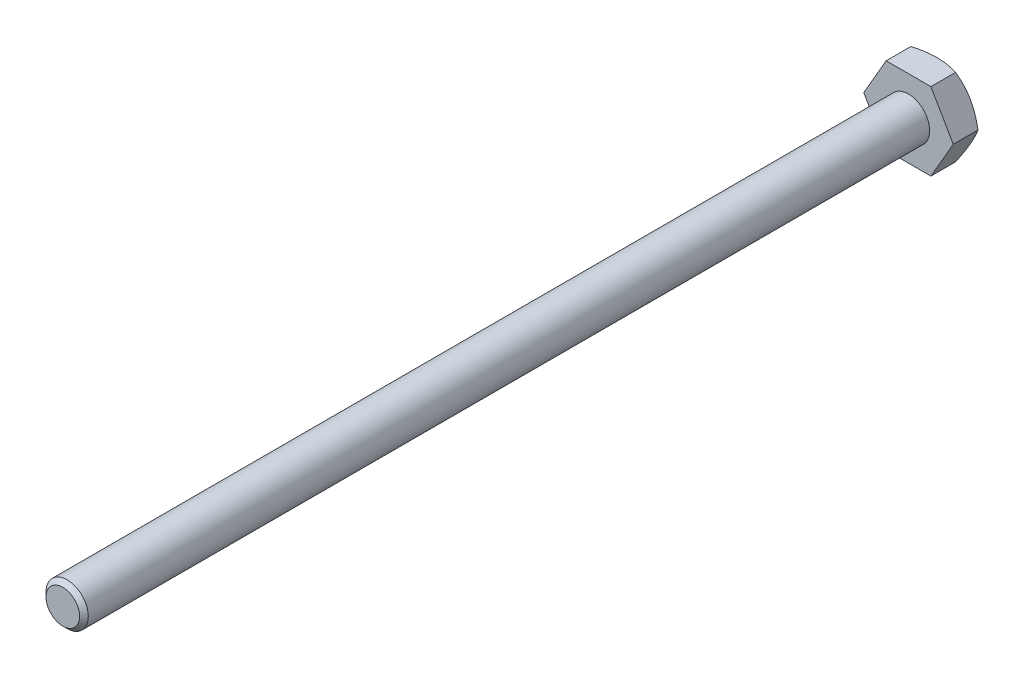
ISO-10303-21;
HEADER;
FILE_DESCRIPTION(('STEP AP214'),'2;1');
FILE_NAME('part.step','',(''),(''),'','','');
FILE_SCHEMA(('AUTOMOTIVE_DESIGN { 1 0 10303 214 1 1 1 1 }'));
ENDSEC;
DATA;
#1=APPLICATION_CONTEXT('core data for automotive mechanical design processes');
#2=APPLICATION_PROTOCOL_DEFINITION('international standard','automotive_design',2000,#1);
#3=PRODUCT_CONTEXT('',#1,'mechanical');
#4=PRODUCT('Part','Part','',(#3));
#5=PRODUCT_RELATED_PRODUCT_CATEGORY('part','',(#4));
#6=PRODUCT_DEFINITION_FORMATION('','',#4);
#7=PRODUCT_DEFINITION_CONTEXT('part definition',#1,'design');
#8=PRODUCT_DEFINITION('design','',#6,#7);
#9=PRODUCT_DEFINITION_SHAPE('','',#8);
#10=(LENGTH_UNIT() NAMED_UNIT(*) SI_UNIT(.MILLI.,.METRE.));
#11=(NAMED_UNIT(*) PLANE_ANGLE_UNIT() SI_UNIT($,.RADIAN.));
#12=(NAMED_UNIT(*) SI_UNIT($,.STERADIAN.) SOLID_ANGLE_UNIT());
#13=UNCERTAINTY_MEASURE_WITH_UNIT(LENGTH_MEASURE(1.E-05),#10,'distance_accuracy_value','');
#14=(GEOMETRIC_REPRESENTATION_CONTEXT(3) GLOBAL_UNCERTAINTY_ASSIGNED_CONTEXT((#13)) GLOBAL_UNIT_ASSIGNED_CONTEXT((#10,
#11,#12)) REPRESENTATION_CONTEXT('',''));
#15=CARTESIAN_POINT('',(0.,0.,0.));
#16=DIRECTION('',(0.,0.,1.));
#17=DIRECTION('',(1.,0.,0.));
#18=AXIS2_PLACEMENT_3D('',#15,#16,#17);
#19=CARTESIAN_POINT('',(1.58771324027147,-2.75,2.));
#20=DIRECTION('',(-0.866025403784439,0.5,0.));
#21=DIRECTION('',(-0.5,-0.866025403784439,0.));
#22=AXIS2_PLACEMENT_3D('',#19,#20,#21);
#23=PLANE('',#22);
#24=CARTESIAN_POINT('',(3.17554195059678,0.000200000000001707,0.245686763364756));
#25=CARTESIAN_POINT('',(3.10576962051743,-0.120649220659902,0.205387662249245));
#26=CARTESIAN_POINT('',(3.03539502097908,-0.242541602622629,0.168736902597647));
#27=CARTESIAN_POINT('',(2.89342717394439,-0.48843712672789,0.104762182969799));
#28=CARTESIAN_POINT('',(2.82183140359858,-0.612444638573854,0.077460855674506));
#29=CARTESIAN_POINT('',(2.67952717191842,-0.858922797975943,0.0349617452941293));
#30=CARTESIAN_POINT('',(2.60884060771577,-0.981355518587416,0.019481118622464));
#31=CARTESIAN_POINT('',(2.46713482015519,-1.22679714236891,0.000999397369945066));
#32=CARTESIAN_POINT('',(2.39611611197038,-1.34980515323291,-0.00201700053739113));
#33=CARTESIAN_POINT('',(2.26341005486544,-1.57965878661079,0.0042531454285534));
#34=CARTESIAN_POINT('',(2.20170285541369,-1.68653879125402,0.0120001542767035));
#35=CARTESIAN_POINT('',(2.07869048467395,-1.89960246733475,0.0365551810643576));
#36=CARTESIAN_POINT('',(2.01738573896433,-2.00578540164889,0.0533715896505804));
#37=CARTESIAN_POINT('',(1.89411967378235,-2.21928848939318,0.0954119223459683));
#38=CARTESIAN_POINT('',(1.83217395817123,-2.32658161614285,0.120814080687237));
#39=CARTESIAN_POINT('',(1.70920651275307,-2.53956747928405,0.17846722583998));
#40=CARTESIAN_POINT('',(1.64818320715446,-2.64526294502665,0.210704663298978));
#41=CARTESIAN_POINT('',(1.58759777021763,-2.7502,0.245686763364763));
#42=B_SPLINE_CURVE_WITH_KNOTS('',3,(#24,#25,#26,#27,#28,#29,#30,#31,#32,#33,#34,#35,#36,#37,#38,
#39,#40,#41),.UNSPECIFIED.,.F.,.F.,(4,2,2,2,2,2,2,2,4),(0.,0.435912828725887,0.872873557116331,
1.29901931904671,1.72464171213573,2.09526089052937,2.46622354066374,2.84541551798557,
3.22386274754524),.UNSPECIFIED.);
#43=CARTESIAN_POINT('',(3.17542648054294,0.,0.245620093061864));
#44=VERTEX_POINT('',#43);
#45=CARTESIAN_POINT('',(2.38156986040721,-1.375,0.));
#46=VERTEX_POINT('',#45);
#47=EDGE_CURVE('E130',#44,#46,#42,.T.);
#48=ORIENTED_EDGE('',*,*,#47,.F.);
#49=DIRECTION('',(0.,0.,-1.));
#50=VECTOR('',#49,1.);
#51=CARTESIAN_POINT('',(3.17542648054294,0.,2.));
#52=LINE('',#51,#50);
#53=CARTESIAN_POINT('',(3.17542648054294,0.,2.));
#54=VERTEX_POINT('',#53);
#55=EDGE_CURVE('E134',#54,#44,#52,.T.);
#56=ORIENTED_EDGE('',*,*,#55,.F.);
#57=DIRECTION('',(0.5,0.866025403784438,0.));
#58=VECTOR('',#57,1.);
#59=CARTESIAN_POINT('',(1.58771324027147,-2.75,2.));
#60=LINE('',#59,#58);
#61=CARTESIAN_POINT('',(1.58771324027147,-2.75,2.));
#62=VERTEX_POINT('',#61);
#63=EDGE_CURVE('E254',#62,#54,#60,.T.);
#64=ORIENTED_EDGE('',*,*,#63,.F.);
#65=DIRECTION('',(0.,0.,-1.));
#66=VECTOR('',#65,1.);
#67=CARTESIAN_POINT('',(1.58771324027147,-2.75,2.));
#68=LINE('',#67,#66);
#69=CARTESIAN_POINT('',(1.58771324027148,-2.75,0.245620093061862));
#70=VERTEX_POINT('',#69);
#71=EDGE_CURVE('E230',#62,#70,#68,.T.);
#72=ORIENTED_EDGE('',*,*,#71,.T.);
#73=EDGE_CURVE('E192',#46,#70,#42,.T.);
#74=ORIENTED_EDGE('',*,*,#73,.F.);
#75=EDGE_LOOP('',(#48,#56,#64,#72,#74));
#76=FACE_BOUND('',#75,.T.);
#77=ADVANCED_FACE('F38',(#76),#23,.F.);
#78=CARTESIAN_POINT('',(3.17542648054294,0.,2.));
#79=DIRECTION('',(-0.866025403784438,-0.5,0.));
#80=DIRECTION('',(0.5,-0.866025403784438,0.));
#81=AXIS2_PLACEMENT_3D('',#78,#79,#80);
#82=PLANE('',#81);
#83=CARTESIAN_POINT('',(1.58759777021763,2.7502,0.245686763364752));
#84=CARTESIAN_POINT('',(1.65737010029698,2.6293507793401,0.205387662249251));
#85=CARTESIAN_POINT('',(1.72774469983533,2.50745839737737,0.168736902597654));
#86=CARTESIAN_POINT('',(1.86971254687003,2.26156287327211,0.104762182969802));
#87=CARTESIAN_POINT('',(1.94130831721583,2.13755536142614,0.077460855674505));
#88=CARTESIAN_POINT('',(2.08361254889599,1.89107720202406,0.0349617452941258));
#89=CARTESIAN_POINT('',(2.15429911309864,1.76864448141258,0.0194811186224622));
#90=CARTESIAN_POINT('',(2.29600490065923,1.52320285763108,0.000999397369942752));
#91=CARTESIAN_POINT('',(2.36702360884404,1.40019484676709,-0.00201700053739559));
#92=CARTESIAN_POINT('',(2.49972966594897,1.17034121338921,0.00425314542855328));
#93=CARTESIAN_POINT('',(2.56143686540073,1.06346120874598,0.0120001542767088));
#94=CARTESIAN_POINT('',(2.68444923614046,0.850397532665251,0.0365551810643632));
#95=CARTESIAN_POINT('',(2.74575398185008,0.744214598351112,0.0533715896505809));
#96=CARTESIAN_POINT('',(2.86902004703206,0.530711510606817,0.0954119223459646));
#97=CARTESIAN_POINT('',(2.93096576264318,0.423418383857145,0.120814080687235));
#98=CARTESIAN_POINT('',(3.05393320806134,0.210432520715948,0.17846722583998));
#99=CARTESIAN_POINT('',(3.11495651365995,0.104737054973347,0.210704663298979));
#100=CARTESIAN_POINT('',(3.17554195059678,-0.000199999999999768,0.245686763364762));
#101=B_SPLINE_CURVE_WITH_KNOTS('',3,(#83,#84,#85,#86,#87,#88,#89,#90,#91,#92,#93,#94,#95,#96,
#97,#98,#99,#100),.UNSPECIFIED.,.F.,.F.,(4,2,2,2,2,2,2,2,4),(0.,0.435912828725887,
0.87287355711633,1.29901931904671,1.72464171213573,2.09526089052937,2.46622354066374,
2.84541551798557,3.22386274754524),.UNSPECIFIED.);
#102=CARTESIAN_POINT('',(1.58771324027147,2.75000000000001,0.245620093061862));
#103=VERTEX_POINT('',#102);
#104=CARTESIAN_POINT('',(2.38156986040721,1.375,0.));
#105=VERTEX_POINT('',#104);
#106=EDGE_CURVE('E109',#103,#105,#101,.T.);
#107=ORIENTED_EDGE('',*,*,#106,.F.);
#108=DIRECTION('',(0.,0.,-1.));
#109=VECTOR('',#108,1.);
#110=CARTESIAN_POINT('',(1.58771324027147,2.75,2.));
#111=LINE('',#110,#109);
#112=CARTESIAN_POINT('',(1.58771324027147,2.75,2.));
#113=VERTEX_POINT('',#112);
#114=EDGE_CURVE('E239',#113,#103,#111,.T.);
#115=ORIENTED_EDGE('',*,*,#114,.F.);
#116=DIRECTION('',(-0.5,0.866025403784438,0.));
#117=VECTOR('',#116,1.);
#118=CARTESIAN_POINT('',(3.17542648054294,0.,2.));
#119=LINE('',#118,#117);
#120=EDGE_CURVE('E258',#54,#113,#119,.T.);
#121=ORIENTED_EDGE('',*,*,#120,.F.);
#122=ORIENTED_EDGE('',*,*,#55,.T.);
#123=EDGE_CURVE('E122',#105,#44,#101,.T.);
#124=ORIENTED_EDGE('',*,*,#123,.F.);
#125=EDGE_LOOP('',(#107,#115,#121,#122,#124));
#126=FACE_BOUND('',#125,.T.);
#127=ADVANCED_FACE('F142',(#126),#82,.F.);
#128=CARTESIAN_POINT('',(1.58771324027147,2.75,2.));
#129=DIRECTION('',(0.,-1.,0.));
#130=DIRECTION('',(0.,0.,-1.));
#131=AXIS2_PLACEMENT_3D('',#128,#129,#130);
#132=PLANE('',#131);
#133=CARTESIAN_POINT('',(-4.31638594918233,2.75,1.36715210704406));
#134=CARTESIAN_POINT('',(-4.19581737051593,2.75,1.30845994096474));
#135=CARTESIAN_POINT('',(-4.07497746694741,2.75,1.25031586425216));
#136=CARTESIAN_POINT('',(-3.83261088383624,2.75,1.13543119741229));
#137=CARTESIAN_POINT('',(-3.71108410410336,2.75,1.07869081888197));
#138=CARTESIAN_POINT('',(-3.46659808789898,2.75,0.966646426591333));
#139=CARTESIAN_POINT('',(-3.34363468385964,2.75,0.911351476138771));
#140=CARTESIAN_POINT('',(-3.09674757673777,2.75,0.802956993957644));
#141=CARTESIAN_POINT('',(-2.97282391790201,2.75,0.749857361778765));
#142=CARTESIAN_POINT('',(-2.71965806564944,2.75,0.644703117588242));
#143=CARTESIAN_POINT('',(-2.59037652858395,2.75,0.592742724367113));
#144=CARTESIAN_POINT('',(-2.33032018429189,2.75,0.492631038352347));
#145=CARTESIAN_POINT('',(-2.19954521421087,2.75,0.444480165603223));
#146=CARTESIAN_POINT('',(-1.9365223444922,2.75,0.353213656190186));
#147=CARTESIAN_POINT('',(-1.80427786301002,2.75,0.310088265151205));
#148=CARTESIAN_POINT('',(-1.53789259482414,2.75,0.230222209632177));
#149=CARTESIAN_POINT('',(-1.40375240288282,2.75,0.193479588678772));
#150=CARTESIAN_POINT('',(-1.13423793476321,2.75,0.128302067791663));
#151=CARTESIAN_POINT('',(-0.998874970875649,2.75,0.0998212369444806));
#152=CARTESIAN_POINT('',(-0.726413092453882,2.75,0.0527456161691685));
#153=CARTESIAN_POINT('',(-0.589314364619273,2.75,0.0341497721022264));
#154=CARTESIAN_POINT('',(-0.315877662564304,2.75,0.00856858652498454));
#155=CARTESIAN_POINT('',(-0.179554395289451,2.75,0.00142992679052184));
#156=CARTESIAN_POINT('',(0.0932131339370638,2.75,-0.00103867463557439));
#157=CARTESIAN_POINT('',(0.229657397936024,2.75,0.00363158744685487));
#158=CARTESIAN_POINT('',(0.459764674388285,2.75,0.0211304631968899));
#159=CARTESIAN_POINT('',(0.553667213671697,2.75,0.0310050171194714));
#160=CARTESIAN_POINT('',(0.740814471055644,2.75,0.0557601395316539));
#161=CARTESIAN_POINT('',(0.834059104056995,2.75,0.0706413439292712));
#162=CARTESIAN_POINT('',(1.11266283109749,2.75,0.122015798898187));
#163=CARTESIAN_POINT('',(1.29679769159136,2.75,0.16523176116353));
#164=CARTESIAN_POINT('',(1.57226006867406,2.75,0.240559912331171));
#165=CARTESIAN_POINT('',(1.66500394654353,2.75,0.267790894506834));
#166=CARTESIAN_POINT('',(1.84959145582333,2.75,0.32517666141727));
#167=CARTESIAN_POINT('',(1.94143508041952,2.75,0.355331468264064));
#168=CARTESIAN_POINT('',(2.12425036464147,2.75,0.4180730218243));
#169=CARTESIAN_POINT('',(2.21522226940175,2.75,0.450659060772913));
#170=CARTESIAN_POINT('',(2.39640501304852,2.75,0.517870145035887));
#171=CARTESIAN_POINT('',(2.48661586829763,2.75,0.552495146383989));
#172=CARTESIAN_POINT('',(2.72631941369535,2.75,0.647111868128763));
#173=CARTESIAN_POINT('',(2.87521406734215,2.75,0.708617133437124));
#174=CARTESIAN_POINT('',(3.17149877963135,2.75,0.83516310809643));
#175=CARTESIAN_POINT('',(3.31888867900128,2.75,0.900204187184536));
#176=CARTESIAN_POINT('',(3.61249860697602,2.75,1.03299372984211));
#177=CARTESIAN_POINT('',(3.75871823242042,2.75,1.10074308197789));
#178=CARTESIAN_POINT('',(4.05017738563285,2.75,1.23832197569377));
#179=CARTESIAN_POINT('',(4.19541688424483,2.75,1.30815157882391));
#180=CARTESIAN_POINT('',(4.63039070223181,2.75,1.52027220806309));
#181=CARTESIAN_POINT('',(4.91893915080497,2.75,1.66499194206911));
#182=CARTESIAN_POINT('',(5.49386340867003,2.75,1.95851426505823));
#183=CARTESIAN_POINT('',(5.78023963786974,2.75,2.1073160378755));
#184=CARTESIAN_POINT('',(6.32194576487134,2.75,2.39216757225533));
#185=CARTESIAN_POINT('',(6.57742037004849,2.75,2.52794261914921));
#186=CARTESIAN_POINT('',(7.08750371442347,2.75,2.8011424527276));
#187=CARTESIAN_POINT('',(7.342112402064,2.75,2.93856733551163));
#188=CARTESIAN_POINT('',(7.84983547824257,2.75,3.21419429818603));
#189=CARTESIAN_POINT('',(8.10295203313655,2.75,3.35239239225699));
#190=CARTESIAN_POINT('',(8.60864374493557,2.75,3.62973059253265));
#191=CARTESIAN_POINT('',(8.86121894150221,2.75,3.76887062638957));
#192=CARTESIAN_POINT('',(9.11360311770116,2.75,3.90835389259638));
#193=B_SPLINE_CURVE_WITH_KNOTS('',3,(#133,#134,#135,#136,#137,#138,#139,#140,#141,#142,#143,
#144,#145,#146,#147,#148,#149,#150,#151,#152,#153,#154,#155,#156,#157,#158,#159,#160,#161,#162,
#163,#164,#165,#166,#167,#168,#169,#170,#171,#172,#173,#174,#175,#176,#177,#178,#179,#180,#181,
#182,#183,#184,#185,#186,#187,#188,#189,#190,#191,#192),.UNSPECIFIED.,.F.,.F.,(4,2,2,2,2,2,2,2,
2,2,2,2,2,2,2,2,2,2,2,2,2,2,2,2,2,2,2,2,2,4),(0.,0.40229060825889,0.804641493784545,
1.20909649725656,1.61353297371179,2.03148461048145,2.44948226730265,2.86665458560835,
3.28369880400757,3.69837799217316,4.11301294991382,4.52205162226934,4.93109735302038,
5.21422195546484,5.49738253190365,6.06398562819833,6.35393648052211,6.64388952582948,
6.93375848874899,7.22362120349519,7.70684704660548,8.19012351781083,8.67355987154435,
9.15701054332951,10.1253686031769,11.0935344400116,11.9614658313278,12.8294480255313,
13.694604925882,14.5596961132789),.UNSPECIFIED.);
#194=CARTESIAN_POINT('',(-1.58771324027147,2.75000000000001,0.245620093061865));
#195=VERTEX_POINT('',#194);
#196=CARTESIAN_POINT('',(0.,2.75,0.));
#197=VERTEX_POINT('',#196);
#198=EDGE_CURVE('E53',#195,#197,#193,.T.);
#199=ORIENTED_EDGE('',*,*,#198,.F.);
#200=DIRECTION('',(0.,0.,-1.));
#201=VECTOR('',#200,1.);
#202=CARTESIAN_POINT('',(-1.58771324027147,2.75,2.));
#203=LINE('',#202,#201);
#204=CARTESIAN_POINT('',(-1.58771324027147,2.75,2.));
#205=VERTEX_POINT('',#204);
#206=EDGE_CURVE('E232',#205,#195,#203,.T.);
#207=ORIENTED_EDGE('',*,*,#206,.F.);
#208=DIRECTION('',(-1.,0.,0.));
#209=VECTOR('',#208,1.);
#210=CARTESIAN_POINT('',(1.58771324027147,2.75,2.));
#211=LINE('',#210,#209);
#212=EDGE_CURVE('E262',#113,#205,#211,.T.);
#213=ORIENTED_EDGE('',*,*,#212,.F.);
#214=ORIENTED_EDGE('',*,*,#114,.T.);
#215=EDGE_CURVE('E116',#197,#103,#193,.T.);
#216=ORIENTED_EDGE('',*,*,#215,.F.);
#217=EDGE_LOOP('',(#199,#207,#213,#214,#216));
#218=FACE_BOUND('',#217,.T.);
#219=ADVANCED_FACE('F203',(#218),#132,.F.);
#220=CARTESIAN_POINT('',(-1.58771324027147,2.75,2.));
#221=DIRECTION('',(0.866025403784439,-0.5,0.));
#222=DIRECTION('',(0.5,0.866025403784439,0.));
#223=AXIS2_PLACEMENT_3D('',#220,#221,#222);
#224=PLANE('',#223);
#225=CARTESIAN_POINT('',(-3.17554195059678,-0.000200000000001425,0.245686763364756));
#226=CARTESIAN_POINT('',(-3.10576962051743,0.120649220659902,0.205387662249246));
#227=CARTESIAN_POINT('',(-3.03539502097908,0.24254160262263,0.168736902597648));
#228=CARTESIAN_POINT('',(-2.89342717394439,0.48843712672789,0.104762182969799));
#229=CARTESIAN_POINT('',(-2.82183140359858,0.612444638573854,0.0774608556745062));
#230=CARTESIAN_POINT('',(-2.67952717191843,0.858922797975944,0.0349617452941298));
#231=CARTESIAN_POINT('',(-2.60884060771577,0.981355518587416,0.019481118622465));
#232=CARTESIAN_POINT('',(-2.46713482015519,1.22679714236891,0.000999397369944724));
#233=CARTESIAN_POINT('',(-2.39611611197038,1.34980515323291,-0.00201700053739321));
#234=CARTESIAN_POINT('',(-2.26341005486544,1.57965878661079,0.00425314542855578));
#235=CARTESIAN_POINT('',(-2.20170285541369,1.68653879125402,0.0120001542767111));
#236=CARTESIAN_POINT('',(-2.07869048467395,1.89960246733475,0.0365551810643651));
#237=CARTESIAN_POINT('',(-2.01738573896434,2.00578540164889,0.0533715896505827));
#238=CARTESIAN_POINT('',(-1.89411967378235,2.21928848939318,0.0954119223459663));
#239=CARTESIAN_POINT('',(-1.83217395817123,2.32658161614285,0.120814080687236));
#240=CARTESIAN_POINT('',(-1.70920651275308,2.53956747928405,0.178467225839981));
#241=CARTESIAN_POINT('',(-1.64818320715446,2.64526294502665,0.21070466329898));
#242=CARTESIAN_POINT('',(-1.58759777021763,2.7502,0.245686763364763));
#243=B_SPLINE_CURVE_WITH_KNOTS('',3,(#225,#226,#227,#228,#229,#230,#231,#232,#233,#234,#235,
#236,#237,#238,#239,#240,#241,#242),.UNSPECIFIED.,.F.,.F.,(4,2,2,2,2,2,2,2,4),(0.,
0.435912828725887,0.872873557116331,1.29901931904671,1.72464171213573,2.09526089052937,
2.46622354066374,2.84541551798557,3.22386274754524),.UNSPECIFIED.);
#244=CARTESIAN_POINT('',(-3.17542648054295,0.,0.245620093061864));
#245=VERTEX_POINT('',#244);
#246=CARTESIAN_POINT('',(-2.38156986040721,1.375,0.));
#247=VERTEX_POINT('',#246);
#248=EDGE_CURVE('E61',#245,#247,#243,.T.);
#249=ORIENTED_EDGE('',*,*,#248,.F.);
#250=DIRECTION('',(0.,0.,-1.));
#251=VECTOR('',#250,1.);
#252=CARTESIAN_POINT('',(-3.17542648054294,0.,2.));
#253=LINE('',#252,#251);
#254=CARTESIAN_POINT('',(-3.17542648054294,0.,2.));
#255=VERTEX_POINT('',#254);
#256=EDGE_CURVE('E229',#255,#245,#253,.T.);
#257=ORIENTED_EDGE('',*,*,#256,.F.);
#258=DIRECTION('',(-0.5,-0.866025403784438,0.));
#259=VECTOR('',#258,1.);
#260=CARTESIAN_POINT('',(-1.58771324027147,2.75,2.));
#261=LINE('',#260,#259);
#262=EDGE_CURVE('E264',#205,#255,#261,.T.);
#263=ORIENTED_EDGE('',*,*,#262,.F.);
#264=ORIENTED_EDGE('',*,*,#206,.T.);
#265=EDGE_CURVE('E121',#247,#195,#243,.T.);
#266=ORIENTED_EDGE('',*,*,#265,.F.);
#267=EDGE_LOOP('',(#249,#257,#263,#264,#266));
#268=FACE_BOUND('',#267,.T.);
#269=ADVANCED_FACE('F248',(#268),#224,.F.);
#270=CARTESIAN_POINT('',(-3.17542648054294,0.,2.));
#271=DIRECTION('',(0.866025403784438,0.5,0.));
#272=DIRECTION('',(-0.5,0.866025403784438,0.));
#273=AXIS2_PLACEMENT_3D('',#270,#271,#272);
#274=PLANE('',#273);
#275=CARTESIAN_POINT('',(-1.58759777021763,-2.7502,0.245686763364752));
#276=CARTESIAN_POINT('',(-1.65737010029698,-2.62935077934009,0.205387662249251));
#277=CARTESIAN_POINT('',(-1.72774469983533,-2.50745839737737,0.168736902597654));
#278=CARTESIAN_POINT('',(-1.86971254687003,-2.26156287327211,0.104762182969802));
#279=CARTESIAN_POINT('',(-1.94130831721583,-2.13755536142614,0.077460855674505));
#280=CARTESIAN_POINT('',(-2.08361254889599,-1.89107720202405,0.0349617452941258));
#281=CARTESIAN_POINT('',(-2.15429911309864,-1.76864448141258,0.0194811186224622));
#282=CARTESIAN_POINT('',(-2.29600490065923,-1.52320285763108,0.000999397369942766));
#283=CARTESIAN_POINT('',(-2.36702360884404,-1.40019484676709,-0.00201700053739556));
#284=CARTESIAN_POINT('',(-2.49972966594897,-1.17034121338921,0.00425314542855335));
#285=CARTESIAN_POINT('',(-2.56143686540073,-1.06346120874598,0.0120001542767089));
#286=CARTESIAN_POINT('',(-2.68444923614047,-0.85039753266525,0.0365551810643633));
#287=CARTESIAN_POINT('',(-2.74575398185008,-0.744214598351111,0.053371589650581));
#288=CARTESIAN_POINT('',(-2.86902004703206,-0.530711510606816,0.0954119223459647));
#289=CARTESIAN_POINT('',(-2.93096576264318,-0.423418383857144,0.120814080687235));
#290=CARTESIAN_POINT('',(-3.05393320806134,-0.210432520715947,0.17846722583998));
#291=CARTESIAN_POINT('',(-3.11495651365995,-0.104737054973346,0.210704663298979));
#292=CARTESIAN_POINT('',(-3.17554195059678,0.000200000000000172,0.245686763364762));
#293=B_SPLINE_CURVE_WITH_KNOTS('',3,(#275,#276,#277,#278,#279,#280,#281,#282,#283,#284,#285,
#286,#287,#288,#289,#290,#291,#292),.UNSPECIFIED.,.F.,.F.,(4,2,2,2,2,2,2,2,4),(0.,
0.435912828725887,0.87287355711633,1.29901931904671,1.72464171213573,2.09526089052937,
2.46622354066374,2.84541551798557,3.22386274754524),.UNSPECIFIED.);
#294=CARTESIAN_POINT('',(-1.58771324027165,-2.75,0.245620093061747));
#295=VERTEX_POINT('',#294);
#296=CARTESIAN_POINT('',(-2.38156986040721,-1.375,0.));
#297=VERTEX_POINT('',#296);
#298=EDGE_CURVE('E185',#295,#297,#293,.T.);
#299=ORIENTED_EDGE('',*,*,#298,.F.);
#300=DIRECTION('',(0.,0.,-1.));
#301=VECTOR('',#300,1.);
#302=CARTESIAN_POINT('',(-1.58771324027147,-2.75,2.));
#303=LINE('',#302,#301);
#304=CARTESIAN_POINT('',(-1.58771324027147,-2.75,2.));
#305=VERTEX_POINT('',#304);
#306=EDGE_CURVE('E223',#305,#295,#303,.T.);
#307=ORIENTED_EDGE('',*,*,#306,.F.);
#308=DIRECTION('',(0.5,-0.866025403784438,0.));
#309=VECTOR('',#308,1.);
#310=CARTESIAN_POINT('',(-3.17542648054294,0.,2.));
#311=LINE('',#310,#309);
#312=EDGE_CURVE('E266',#255,#305,#311,.T.);
#313=ORIENTED_EDGE('',*,*,#312,.F.);
#314=ORIENTED_EDGE('',*,*,#256,.T.);
#315=EDGE_CURVE('E144',#297,#245,#293,.T.);
#316=ORIENTED_EDGE('',*,*,#315,.F.);
#317=EDGE_LOOP('',(#299,#307,#313,#314,#316));
#318=FACE_BOUND('',#317,.T.);
#319=ADVANCED_FACE('F221',(#318),#274,.F.);
#320=CARTESIAN_POINT('',(-1.58771324027147,-2.75,2.));
#321=DIRECTION('',(0.,1.,0.));
#322=DIRECTION('',(-1.,0.,0.));
#323=AXIS2_PLACEMENT_3D('',#320,#321,#322);
#324=PLANE('',#323);
#325=CARTESIAN_POINT('',(-4.31638594918233,-2.75,1.36715210704406));
#326=CARTESIAN_POINT('',(-4.19581737051593,-2.75,1.30845994096474));
#327=CARTESIAN_POINT('',(-4.07497746694741,-2.75,1.25031586425216));
#328=CARTESIAN_POINT('',(-3.83261088383624,-2.75,1.13543119741229));
#329=CARTESIAN_POINT('',(-3.71108410410336,-2.75,1.07869081888197));
#330=CARTESIAN_POINT('',(-3.46659808789898,-2.75,0.966646426591332));
#331=CARTESIAN_POINT('',(-3.34363468385964,-2.75,0.91135147613877));
#332=CARTESIAN_POINT('',(-3.09674757673777,-2.75,0.802956993957643));
#333=CARTESIAN_POINT('',(-2.97282391790201,-2.75,0.749857361778764));
#334=CARTESIAN_POINT('',(-2.71965806564944,-2.75,0.644703117588242));
#335=CARTESIAN_POINT('',(-2.59037652858396,-2.75,0.592742724367112));
#336=CARTESIAN_POINT('',(-2.33032018429189,-2.75,0.492631038352346));
#337=CARTESIAN_POINT('',(-2.19954521421087,-2.75,0.444480165603222));
#338=CARTESIAN_POINT('',(-1.9365223444922,-2.75,0.353213656190185));
#339=CARTESIAN_POINT('',(-1.80427786301002,-2.75,0.310088265151204));
#340=CARTESIAN_POINT('',(-1.53789259482414,-2.75,0.230222209632176));
#341=CARTESIAN_POINT('',(-1.40375240288282,-2.75,0.193479588678771));
#342=CARTESIAN_POINT('',(-1.13423793476321,-2.75,0.128302067791662));
#343=CARTESIAN_POINT('',(-0.998874970875648,-2.75,0.0998212369444804));
#344=CARTESIAN_POINT('',(-0.72641309245388,-2.75,0.0527456161691683));
#345=CARTESIAN_POINT('',(-0.589314364619271,-2.75,0.034149772102226));
#346=CARTESIAN_POINT('',(-0.315877662564302,-2.75,0.00856858652498411));
#347=CARTESIAN_POINT('',(-0.17955439528945,-2.75,0.00142992679052146));
#348=CARTESIAN_POINT('',(0.0932131339370649,-2.75,-0.0010386746355746));
#349=CARTESIAN_POINT('',(0.229657397936025,-2.75,0.00363158744685481));
#350=CARTESIAN_POINT('',(0.459764674388286,-2.75,0.0211304631968899));
#351=CARTESIAN_POINT('',(0.553667213671699,-2.75,0.0310050171194715));
#352=CARTESIAN_POINT('',(0.740814471055646,-2.75,0.055760139531654));
#353=CARTESIAN_POINT('',(0.834059104056997,-2.75,0.0706413439292714));
#354=CARTESIAN_POINT('',(1.11266283109749,-2.75,0.122015798898187));
#355=CARTESIAN_POINT('',(1.29679769159136,-2.75,0.165231761163531));
#356=CARTESIAN_POINT('',(1.57226006867406,-2.75,0.240559912331172));
#357=CARTESIAN_POINT('',(1.66500394654354,-2.75,0.267790894506835));
#358=CARTESIAN_POINT('',(1.84959145582333,-2.75,0.32517666141727));
#359=CARTESIAN_POINT('',(1.94143508041952,-2.75,0.355331468264064));
#360=CARTESIAN_POINT('',(2.12425036464147,-2.75,0.418073021824301));
#361=CARTESIAN_POINT('',(2.21522226940175,-2.75,0.450659060772914));
#362=CARTESIAN_POINT('',(2.39640501304852,-2.75,0.517870145035888));
#363=CARTESIAN_POINT('',(2.48661586829763,-2.75,0.55249514638399));
#364=CARTESIAN_POINT('',(2.72631941369536,-2.75,0.647111868128763));
#365=CARTESIAN_POINT('',(2.87521406734216,-2.75,0.708617133437119));
#366=CARTESIAN_POINT('',(3.17149877963135,-2.75,0.835163108096429));
#367=CARTESIAN_POINT('',(3.31888867900128,-2.75,0.900204187184543));
#368=CARTESIAN_POINT('',(3.61249860697602,-2.75,1.03299372984212));
#369=CARTESIAN_POINT('',(3.75871823242042,-2.75,1.1007430819779));
#370=CARTESIAN_POINT('',(4.05017738563285,-2.75,1.23832197569377));
#371=CARTESIAN_POINT('',(4.19541688424483,-2.75,1.30815157882391));
#372=CARTESIAN_POINT('',(4.63039070223181,-2.75,1.52027220806309));
#373=CARTESIAN_POINT('',(4.91893915080497,-2.75,1.66499194206911));
#374=CARTESIAN_POINT('',(5.49386340867003,-2.75,1.95851426505823));
#375=CARTESIAN_POINT('',(5.78023963786974,-2.75,2.1073160378755));
#376=CARTESIAN_POINT('',(6.32194576487134,-2.75,2.39216757225533));
#377=CARTESIAN_POINT('',(6.57742037004849,-2.75,2.52794261914921));
#378=CARTESIAN_POINT('',(7.08750371442347,-2.75,2.8011424527276));
#379=CARTESIAN_POINT('',(7.342112402064,-2.75,2.93856733551163));
#380=CARTESIAN_POINT('',(7.84983547824257,-2.75,3.21419429818603));
#381=CARTESIAN_POINT('',(8.10295203313655,-2.75,3.352392392257));
#382=CARTESIAN_POINT('',(8.60864374493557,-2.75,3.62973059253266));
#383=CARTESIAN_POINT('',(8.8612189415022,-2.75,3.76887062638958));
#384=CARTESIAN_POINT('',(9.11360311770116,-2.75,3.90835389259638));
#385=B_SPLINE_CURVE_WITH_KNOTS('',3,(#325,#326,#327,#328,#329,#330,#331,#332,#333,#334,#335,
#336,#337,#338,#339,#340,#341,#342,#343,#344,#345,#346,#347,#348,#349,#350,#351,#352,#353,#354,
#355,#356,#357,#358,#359,#360,#361,#362,#363,#364,#365,#366,#367,#368,#369,#370,#371,#372,#373,
#374,#375,#376,#377,#378,#379,#380,#381,#382,#383,#384),.UNSPECIFIED.,.F.,.F.,(4,2,2,2,2,2,2,2,
2,2,2,2,2,2,2,2,2,2,2,2,2,2,2,2,2,2,2,2,2,4),(0.,0.402290608258889,0.804641493784545,
1.20909649725656,1.61353297371179,2.03148461048145,2.44948226730265,2.86665458560835,
3.28369880400757,3.69837799217316,4.11301294991382,4.52205162226934,4.93109735302038,
5.21422195546485,5.49738253190365,6.06398562819833,6.35393648052211,6.64388952582949,
6.93375848874899,7.22362120349519,7.70684704660548,8.19012351781083,8.67355987154435,
9.15701054332951,10.1253686031769,11.0935344400116,11.9614658313278,12.8294480255313,
13.694604925882,14.5596961132789),.UNSPECIFIED.);
#386=CARTESIAN_POINT('',(0.,-2.75,0.));
#387=VERTEX_POINT('',#386);
#388=EDGE_CURVE('E207',#70,#387,#385,.F.);
#389=ORIENTED_EDGE('',*,*,#388,.F.);
#390=ORIENTED_EDGE('',*,*,#71,.F.);
#391=DIRECTION('',(1.,0.,0.));
#392=VECTOR('',#391,1.);
#393=CARTESIAN_POINT('',(-1.58771324027147,-2.75,2.));
#394=LINE('',#393,#392);
#395=EDGE_CURVE('E228',#305,#62,#394,.T.);
#396=ORIENTED_EDGE('',*,*,#395,.F.);
#397=ORIENTED_EDGE('',*,*,#306,.T.);
#398=EDGE_CURVE('E139',#387,#295,#385,.F.);
#399=ORIENTED_EDGE('',*,*,#398,.F.);
#400=EDGE_LOOP('',(#389,#390,#396,#397,#399));
#401=FACE_BOUND('',#400,.T.);
#402=ADVANCED_FACE('F226',(#401),#324,.F.);
#403=CARTESIAN_POINT('',(3.17542648054294,0.,2.));
#404=DIRECTION('',(0.,0.,1.));
#405=DIRECTION('',(1.,0.,0.));
#406=AXIS2_PLACEMENT_3D('',#403,#404,#405);
#407=PLANE('',#406);
#408=ORIENTED_EDGE('',*,*,#63,.T.);
#409=ORIENTED_EDGE('',*,*,#120,.T.);
#410=ORIENTED_EDGE('',*,*,#212,.T.);
#411=ORIENTED_EDGE('',*,*,#262,.T.);
#412=ORIENTED_EDGE('',*,*,#312,.T.);
#413=ORIENTED_EDGE('',*,*,#395,.T.);
#414=EDGE_LOOP('',(#408,#409,#410,#411,#412,#413));
#415=FACE_BOUND('',#414,.T.);
#416=CARTESIAN_POINT('',(0.,0.,2.));
#417=DIRECTION('',(0.,0.,1.));
#418=DIRECTION('',(1.,0.,0.));
#419=AXIS2_PLACEMENT_3D('',#416,#417,#418);
#420=CIRCLE('',#419,1.5);
#421=CARTESIAN_POINT('',(1.5,0.,2.));
#422=VERTEX_POINT('',#421);
#423=EDGE_CURVE('E252',#422,#422,#420,.T.);
#424=ORIENTED_EDGE('',*,*,#423,.F.);
#425=EDGE_LOOP('',(#424));
#426=FACE_BOUND('',#425,.T.);
#427=ADVANCED_FACE('F268',(#415,#426),#407,.T.);
#428=CARTESIAN_POINT('',(0.,0.,62.));
#429=DIRECTION('',(0.,0.,-1.));
#430=DIRECTION('',(-1.,0.,0.));
#431=AXIS2_PLACEMENT_3D('',#428,#429,#430);
#432=CYLINDRICAL_SURFACE('',#431,1.5);
#433=CARTESIAN_POINT('',(0.,0.,61.693));
#434=DIRECTION('',(0.,0.,1.));
#435=DIRECTION('',(1.,0.,0.));
#436=AXIS2_PLACEMENT_3D('',#433,#434,#435);
#437=CIRCLE('',#436,1.5);
#438=CARTESIAN_POINT('',(1.5,0.,61.693));
#439=VERTEX_POINT('',#438);
#440=EDGE_CURVE('E11',#439,#439,#437,.F.);
#441=ORIENTED_EDGE('',*,*,#440,.T.);
#442=EDGE_LOOP('',(#441));
#443=FACE_BOUND('',#442,.T.);
#444=ORIENTED_EDGE('',*,*,#423,.T.);
#445=EDGE_LOOP('',(#444));
#446=FACE_BOUND('',#445,.T.);
#447=ADVANCED_FACE('F286',(#443,#446),#432,.T.);
#448=CARTESIAN_POINT('',(0.,0.,62.));
#449=DIRECTION('',(0.,0.,1.));
#450=DIRECTION('',(1.,0.,0.));
#451=AXIS2_PLACEMENT_3D('',#448,#449,#450);
#452=PLANE('',#451);
#453=CARTESIAN_POINT('',(0.,0.,62.));
#454=DIRECTION('',(0.,0.,1.));
#455=DIRECTION('',(1.,0.,0.));
#456=AXIS2_PLACEMENT_3D('',#453,#454,#455);
#457=CIRCLE('',#456,1.19300000000001);
#458=CARTESIAN_POINT('',(1.19300000000001,0.,62.));
#459=VERTEX_POINT('',#458);
#460=EDGE_CURVE('E46',#459,#459,#457,.T.);
#461=ORIENTED_EDGE('',*,*,#460,.T.);
#462=EDGE_LOOP('',(#461));
#463=FACE_BOUND('',#462,.T.);
#464=ADVANCED_FACE('F172',(#463),#452,.T.);
#465=CARTESIAN_POINT('',(0.,0.,57.7350269189618));
#466=DIRECTION('',(0.,0.,1.));
#467=DIRECTION('',(1.,0.,0.));
#468=AXIS2_PLACEMENT_3D('',#465,#466,#467);
#469=CONICAL_SURFACE('',#468,102.75,1.0471975511966);
#470=ORIENTED_EDGE('',*,*,#123,.T.);
#471=ORIENTED_EDGE('',*,*,#47,.T.);
#472=CARTESIAN_POINT('',(0.,0.,0.));
#473=DIRECTION('',(0.,0.,1.));
#474=DIRECTION('',(1.,0.,0.));
#475=AXIS2_PLACEMENT_3D('',#472,#473,#474);
#476=CIRCLE('',#475,2.74999999999999);
#477=EDGE_CURVE('E127',#46,#105,#476,.T.);
#478=ORIENTED_EDGE('',*,*,#477,.T.);
#479=EDGE_LOOP('',(#470,#471,#478));
#480=FACE_BOUND('',#479,.T.);
#481=ADVANCED_FACE('F128',(#480),#469,.T.);
#482=ORIENTED_EDGE('',*,*,#73,.T.);
#483=ORIENTED_EDGE('',*,*,#388,.T.);
#484=EDGE_CURVE('E133',#387,#46,#476,.T.);
#485=ORIENTED_EDGE('',*,*,#484,.T.);
#486=EDGE_LOOP('',(#482,#483,#485));
#487=FACE_BOUND('',#486,.T.);
#488=ADVANCED_FACE('F245',(#487),#469,.T.);
#489=ORIENTED_EDGE('',*,*,#298,.T.);
#490=EDGE_CURVE('E216',#297,#387,#476,.T.);
#491=ORIENTED_EDGE('',*,*,#490,.T.);
#492=ORIENTED_EDGE('',*,*,#398,.T.);
#493=EDGE_LOOP('',(#489,#491,#492));
#494=FACE_BOUND('',#493,.T.);
#495=ADVANCED_FACE('F171',(#494),#469,.T.);
#496=ORIENTED_EDGE('',*,*,#248,.T.);
#497=EDGE_CURVE('E244',#247,#297,#476,.T.);
#498=ORIENTED_EDGE('',*,*,#497,.T.);
#499=ORIENTED_EDGE('',*,*,#315,.T.);
#500=EDGE_LOOP('',(#496,#498,#499));
#501=FACE_BOUND('',#500,.T.);
#502=ADVANCED_FACE('F170',(#501),#469,.T.);
#503=ORIENTED_EDGE('',*,*,#198,.T.);
#504=EDGE_CURVE('E136',#197,#247,#476,.T.);
#505=ORIENTED_EDGE('',*,*,#504,.T.);
#506=ORIENTED_EDGE('',*,*,#265,.T.);
#507=EDGE_LOOP('',(#503,#505,#506));
#508=FACE_BOUND('',#507,.T.);
#509=ADVANCED_FACE('F166',(#508),#469,.T.);
#510=ORIENTED_EDGE('',*,*,#215,.T.);
#511=ORIENTED_EDGE('',*,*,#106,.T.);
#512=CARTESIAN_POINT('',(0.,0.,0.));
#513=DIRECTION('',(0.,0.,1.));
#514=DIRECTION('',(1.,0.,0.));
#515=AXIS2_PLACEMENT_3D('',#512,#513,#514);
#516=CIRCLE('',#515,2.75);
#517=EDGE_CURVE('E113',#105,#197,#516,.T.);
#518=ORIENTED_EDGE('',*,*,#517,.T.);
#519=EDGE_LOOP('',(#510,#511,#518));
#520=FACE_BOUND('',#519,.T.);
#521=ADVANCED_FACE('F111',(#520),#469,.T.);
#522=CARTESIAN_POINT('',(3.17542648054294,0.,0.));
#523=DIRECTION('',(0.,0.,1.));
#524=DIRECTION('',(1.,0.,0.));
#525=AXIS2_PLACEMENT_3D('',#522,#523,#524);
#526=PLANE('',#525);
#527=ORIENTED_EDGE('',*,*,#517,.F.);
#528=ORIENTED_EDGE('',*,*,#477,.F.);
#529=ORIENTED_EDGE('',*,*,#484,.F.);
#530=ORIENTED_EDGE('',*,*,#490,.F.);
#531=ORIENTED_EDGE('',*,*,#497,.F.);
#532=ORIENTED_EDGE('',*,*,#504,.F.);
#533=EDGE_LOOP('',(#527,#528,#529,#530,#531,#532));
#534=FACE_BOUND('',#533,.T.);
#535=ADVANCED_FACE('F137',(#534),#526,.F.);
#536=CARTESIAN_POINT('',(0.,0.,62.));
#537=DIRECTION('',(0.,0.,-1.));
#538=DIRECTION('',(-1.,0.,0.));
#539=AXIS2_PLACEMENT_3D('',#536,#537,#538);
#540=CONICAL_SURFACE('',#539,1.19300000000001,0.785398163397447);
#541=ORIENTED_EDGE('',*,*,#440,.F.);
#542=EDGE_LOOP('',(#541));
#543=FACE_BOUND('',#542,.T.);
#544=ORIENTED_EDGE('',*,*,#460,.F.);
#545=EDGE_LOOP('',(#544));
#546=FACE_BOUND('',#545,.T.);
#547=ADVANCED_FACE('F40',(#543,#546),#540,.T.);
#548=CLOSED_SHELL('',(#77,#127,#219,#269,#319,#402,#427,#447,#464,#481,#488,#495,#502,#509,#521,
#535,#547));
#549=MANIFOLD_SOLID_BREP('B2',#548);
#550=ADVANCED_BREP_SHAPE_REPRESENTATION('',(#18,#549),#14);
#551=SHAPE_DEFINITION_REPRESENTATION(#9,#550);
ENDSEC;
END-ISO-10303-21;
